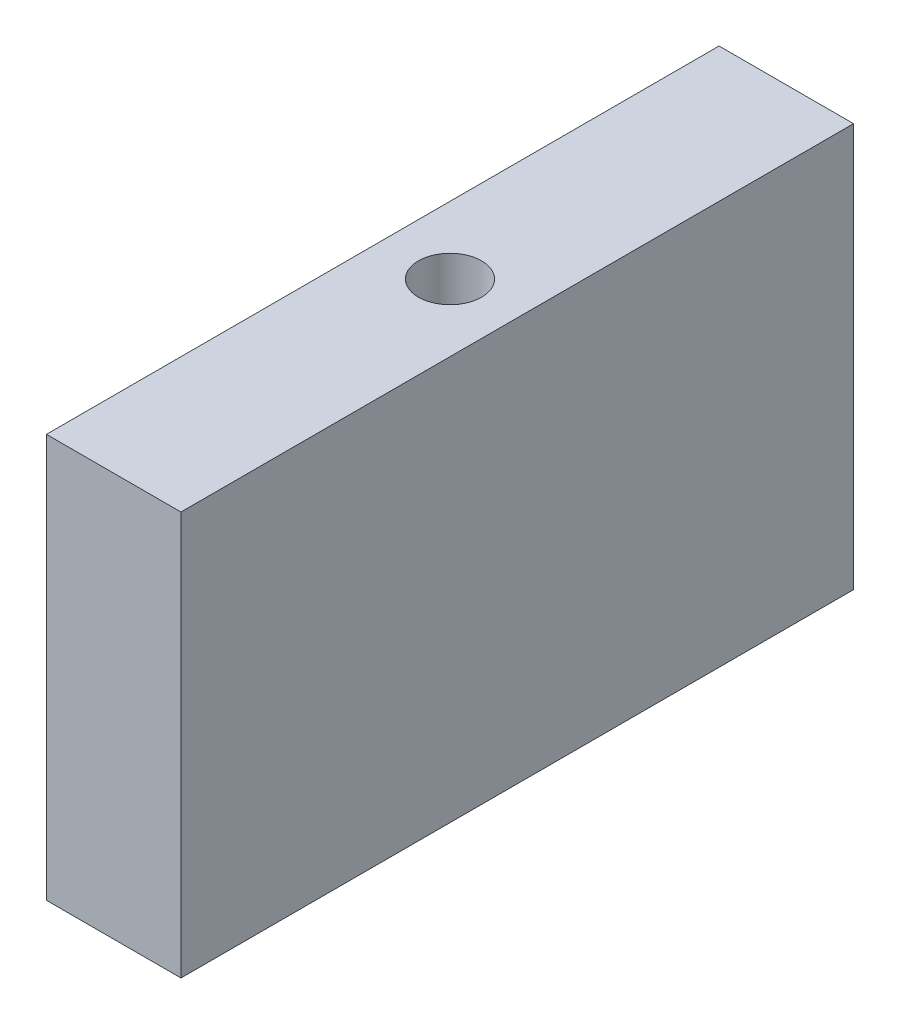
ISO-10303-21;
HEADER;
FILE_DESCRIPTION(('STEP AP214'),'2;1');
FILE_NAME('part.step','',(''),(''),'','','');
FILE_SCHEMA(('AUTOMOTIVE_DESIGN { 1 0 10303 214 1 1 1 1 }'));
ENDSEC;
DATA;
#1=APPLICATION_CONTEXT('core data for automotive mechanical design processes');
#2=APPLICATION_PROTOCOL_DEFINITION('international standard','automotive_design',2000,#1);
#3=PRODUCT_CONTEXT('',#1,'mechanical');
#4=PRODUCT('Part','Part','',(#3));
#5=PRODUCT_RELATED_PRODUCT_CATEGORY('part','',(#4));
#6=PRODUCT_DEFINITION_FORMATION('','',#4);
#7=PRODUCT_DEFINITION_CONTEXT('part definition',#1,'design');
#8=PRODUCT_DEFINITION('design','',#6,#7);
#9=PRODUCT_DEFINITION_SHAPE('','',#8);
#10=(LENGTH_UNIT() NAMED_UNIT(*) SI_UNIT(.MILLI.,.METRE.));
#11=(NAMED_UNIT(*) PLANE_ANGLE_UNIT() SI_UNIT($,.RADIAN.));
#12=(NAMED_UNIT(*) SI_UNIT($,.STERADIAN.) SOLID_ANGLE_UNIT());
#13=UNCERTAINTY_MEASURE_WITH_UNIT(LENGTH_MEASURE(1.E-05),#10,'distance_accuracy_value','');
#14=(GEOMETRIC_REPRESENTATION_CONTEXT(3) GLOBAL_UNCERTAINTY_ASSIGNED_CONTEXT((#13)) GLOBAL_UNIT_ASSIGNED_CONTEXT((#10,
#11,#12)) REPRESENTATION_CONTEXT('',''));
#15=CARTESIAN_POINT('',(0.,0.,0.));
#16=DIRECTION('',(0.,0.,1.));
#17=DIRECTION('',(1.,0.,0.));
#18=AXIS2_PLACEMENT_3D('',#15,#16,#17);
#19=CARTESIAN_POINT('',(1.27,7.62,6.35));
#20=DIRECTION('',(-1.,0.,0.));
#21=DIRECTION('',(0.,0.,1.));
#22=AXIS2_PLACEMENT_3D('',#19,#20,#21);
#23=PLANE('',#22);
#24=DIRECTION('',(0.,0.,-1.));
#25=VECTOR('',#24,1.);
#26=CARTESIAN_POINT('',(1.27,0.,6.35));
#27=LINE('',#26,#25);
#28=CARTESIAN_POINT('',(1.27,0.,6.35));
#29=VERTEX_POINT('',#28);
#30=CARTESIAN_POINT('',(1.27,0.,-6.35));
#31=VERTEX_POINT('',#30);
#32=EDGE_CURVE('E98',#29,#31,#27,.T.);
#33=ORIENTED_EDGE('',*,*,#32,.T.);
#34=DIRECTION('',(0.,-1.,0.));
#35=VECTOR('',#34,1.);
#36=CARTESIAN_POINT('',(1.27,7.62,-6.35));
#37=LINE('',#36,#35);
#38=CARTESIAN_POINT('',(1.27,7.62,-6.35));
#39=VERTEX_POINT('',#38);
#40=EDGE_CURVE('E11',#39,#31,#37,.T.);
#41=ORIENTED_EDGE('',*,*,#40,.F.);
#42=DIRECTION('',(0.,0.,-1.));
#43=VECTOR('',#42,1.);
#44=CARTESIAN_POINT('',(1.27,7.62,6.35));
#45=LINE('',#44,#43);
#46=CARTESIAN_POINT('',(1.27,7.62,6.35));
#47=VERTEX_POINT('',#46);
#48=EDGE_CURVE('E86',#47,#39,#45,.T.);
#49=ORIENTED_EDGE('',*,*,#48,.F.);
#50=DIRECTION('',(0.,-1.,0.));
#51=VECTOR('',#50,1.);
#52=CARTESIAN_POINT('',(1.27,7.62,6.35));
#53=LINE('',#52,#51);
#54=EDGE_CURVE('E94',#47,#29,#53,.T.);
#55=ORIENTED_EDGE('',*,*,#54,.T.);
#56=EDGE_LOOP('',(#33,#41,#49,#55));
#57=FACE_BOUND('',#56,.T.);
#58=ADVANCED_FACE('F35',(#57),#23,.F.);
#59=CARTESIAN_POINT('',(-1.27,7.62,-6.35));
#60=DIRECTION('',(0.,0.,1.));
#61=DIRECTION('',(1.,0.,0.));
#62=AXIS2_PLACEMENT_3D('',#59,#60,#61);
#63=PLANE('',#62);
#64=DIRECTION('',(-1.,0.,0.));
#65=VECTOR('',#64,1.);
#66=CARTESIAN_POINT('',(-1.27,0.,-6.35));
#67=LINE('',#66,#65);
#68=CARTESIAN_POINT('',(-1.27,0.,-6.35));
#69=VERTEX_POINT('',#68);
#70=EDGE_CURVE('E90',#31,#69,#67,.T.);
#71=ORIENTED_EDGE('',*,*,#70,.T.);
#72=DIRECTION('',(0.,-1.,0.));
#73=VECTOR('',#72,1.);
#74=CARTESIAN_POINT('',(-1.27,7.62,-6.35));
#75=LINE('',#74,#73);
#76=CARTESIAN_POINT('',(-1.27,7.62,-6.35));
#77=VERTEX_POINT('',#76);
#78=EDGE_CURVE('E43',#77,#69,#75,.T.);
#79=ORIENTED_EDGE('',*,*,#78,.F.);
#80=DIRECTION('',(-1.,0.,0.));
#81=VECTOR('',#80,1.);
#82=CARTESIAN_POINT('',(-1.27,7.62,-6.35));
#83=LINE('',#82,#81);
#84=EDGE_CURVE('E81',#39,#77,#83,.T.);
#85=ORIENTED_EDGE('',*,*,#84,.F.);
#86=ORIENTED_EDGE('',*,*,#40,.T.);
#87=EDGE_LOOP('',(#71,#79,#85,#86));
#88=FACE_BOUND('',#87,.T.);
#89=ADVANCED_FACE('F89',(#88),#63,.F.);
#90=CARTESIAN_POINT('',(-1.27,7.62,6.35));
#91=DIRECTION('',(1.,0.,0.));
#92=DIRECTION('',(0.,0.,-1.));
#93=AXIS2_PLACEMENT_3D('',#90,#91,#92);
#94=PLANE('',#93);
#95=DIRECTION('',(0.,0.,1.));
#96=VECTOR('',#95,1.);
#97=CARTESIAN_POINT('',(-1.27,0.,6.35));
#98=LINE('',#97,#96);
#99=CARTESIAN_POINT('',(-1.27,0.,6.35));
#100=VERTEX_POINT('',#99);
#101=EDGE_CURVE('E68',#69,#100,#98,.T.);
#102=ORIENTED_EDGE('',*,*,#101,.T.);
#103=DIRECTION('',(0.,-1.,0.));
#104=VECTOR('',#103,1.);
#105=CARTESIAN_POINT('',(-1.27,7.62,6.35));
#106=LINE('',#105,#104);
#107=CARTESIAN_POINT('',(-1.27,7.62,6.35));
#108=VERTEX_POINT('',#107);
#109=EDGE_CURVE('E91',#108,#100,#106,.T.);
#110=ORIENTED_EDGE('',*,*,#109,.F.);
#111=DIRECTION('',(0.,0.,1.));
#112=VECTOR('',#111,1.);
#113=CARTESIAN_POINT('',(-1.27,7.62,6.35));
#114=LINE('',#113,#112);
#115=EDGE_CURVE('E84',#77,#108,#114,.T.);
#116=ORIENTED_EDGE('',*,*,#115,.F.);
#117=ORIENTED_EDGE('',*,*,#78,.T.);
#118=EDGE_LOOP('',(#102,#110,#116,#117));
#119=FACE_BOUND('',#118,.T.);
#120=ADVANCED_FACE('F92',(#119),#94,.F.);
#121=CARTESIAN_POINT('',(-1.27,7.62,6.35));
#122=DIRECTION('',(0.,0.,-1.));
#123=DIRECTION('',(-1.,0.,0.));
#124=AXIS2_PLACEMENT_3D('',#121,#122,#123);
#125=PLANE('',#124);
#126=DIRECTION('',(1.,0.,0.));
#127=VECTOR('',#126,1.);
#128=CARTESIAN_POINT('',(-1.27,0.,6.35));
#129=LINE('',#128,#127);
#130=EDGE_CURVE('E74',#100,#29,#129,.T.);
#131=ORIENTED_EDGE('',*,*,#130,.T.);
#132=ORIENTED_EDGE('',*,*,#54,.F.);
#133=DIRECTION('',(1.,0.,0.));
#134=VECTOR('',#133,1.);
#135=CARTESIAN_POINT('',(-1.27,7.62,6.35));
#136=LINE('',#135,#134);
#137=EDGE_CURVE('E51',#108,#47,#136,.T.);
#138=ORIENTED_EDGE('',*,*,#137,.F.);
#139=ORIENTED_EDGE('',*,*,#109,.T.);
#140=EDGE_LOOP('',(#131,#132,#138,#139));
#141=FACE_BOUND('',#140,.T.);
#142=ADVANCED_FACE('F106',(#141),#125,.F.);
#143=CARTESIAN_POINT('',(0.,7.62,0.));
#144=DIRECTION('',(0.,-1.,0.));
#145=DIRECTION('',(0.,0.,-1.));
#146=AXIS2_PLACEMENT_3D('',#143,#144,#145);
#147=PLANE('',#146);
#148=CARTESIAN_POINT('',(0.,7.62,0.));
#149=DIRECTION('',(0.,1.,0.));
#150=DIRECTION('',(0.,0.,1.));
#151=AXIS2_PLACEMENT_3D('',#148,#149,#150);
#152=CIRCLE('',#151,0.595629999999988);
#153=CARTESIAN_POINT('',(0.,7.62,0.595629999999988));
#154=VERTEX_POINT('',#153);
#155=EDGE_CURVE('E114',#154,#154,#152,.T.);
#156=ORIENTED_EDGE('',*,*,#155,.F.);
#157=EDGE_LOOP('',(#156));
#158=FACE_BOUND('',#157,.T.);
#159=ORIENTED_EDGE('',*,*,#48,.T.);
#160=ORIENTED_EDGE('',*,*,#84,.T.);
#161=ORIENTED_EDGE('',*,*,#115,.T.);
#162=ORIENTED_EDGE('',*,*,#137,.T.);
#163=EDGE_LOOP('',(#159,#160,#161,#162));
#164=FACE_BOUND('',#163,.T.);
#165=ADVANCED_FACE('F82',(#158,#164),#147,.F.);
#166=CARTESIAN_POINT('',(0.,0.,0.));
#167=DIRECTION('',(0.,-1.,0.));
#168=DIRECTION('',(0.,0.,-1.));
#169=AXIS2_PLACEMENT_3D('',#166,#167,#168);
#170=PLANE('',#169);
#171=CARTESIAN_POINT('',(0.,0.,0.));
#172=DIRECTION('',(0.,1.,0.));
#173=DIRECTION('',(0.,0.,1.));
#174=AXIS2_PLACEMENT_3D('',#171,#172,#173);
#175=CIRCLE('',#174,0.595629999999998);
#176=CARTESIAN_POINT('',(0.,0.,0.595629999999998));
#177=VERTEX_POINT('',#176);
#178=EDGE_CURVE('E101',#177,#177,#175,.T.);
#179=ORIENTED_EDGE('',*,*,#178,.T.);
#180=EDGE_LOOP('',(#179));
#181=FACE_BOUND('',#180,.T.);
#182=ORIENTED_EDGE('',*,*,#32,.F.);
#183=ORIENTED_EDGE('',*,*,#130,.F.);
#184=ORIENTED_EDGE('',*,*,#101,.F.);
#185=ORIENTED_EDGE('',*,*,#70,.F.);
#186=EDGE_LOOP('',(#182,#183,#184,#185));
#187=FACE_BOUND('',#186,.T.);
#188=ADVANCED_FACE('F109',(#181,#187),#170,.T.);
#189=CARTESIAN_POINT('',(0.,7.62,0.));
#190=DIRECTION('',(0.,1.,0.));
#191=DIRECTION('',(0.,0.,1.));
#192=AXIS2_PLACEMENT_3D('',#189,#190,#191);
#193=CYLINDRICAL_SURFACE('',#192,0.595629999999993);
#194=ORIENTED_EDGE('',*,*,#178,.F.);
#195=EDGE_LOOP('',(#194));
#196=FACE_BOUND('',#195,.T.);
#197=ORIENTED_EDGE('',*,*,#155,.T.);
#198=EDGE_LOOP('',(#197));
#199=FACE_BOUND('',#198,.T.);
#200=ADVANCED_FACE('F118',(#196,#199),#193,.F.);
#201=CLOSED_SHELL('',(#58,#89,#120,#142,#165,#188,#200));
#202=MANIFOLD_SOLID_BREP('B2',#201);
#203=ADVANCED_BREP_SHAPE_REPRESENTATION('',(#18,#202),#14);
#204=SHAPE_DEFINITION_REPRESENTATION(#9,#203);
ENDSEC;
END-ISO-10303-21;
